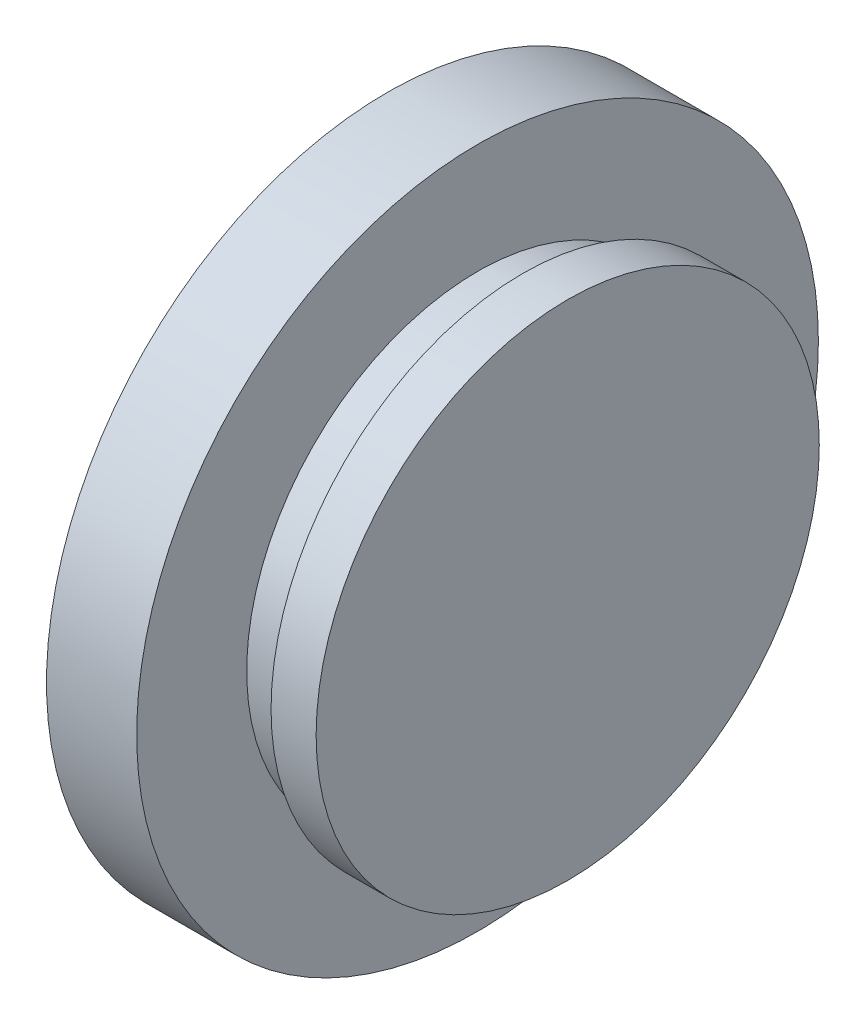
ISO-10303-21;
HEADER;
FILE_DESCRIPTION(('STEP AP214'),'2;1');
FILE_NAME('part.step','',(''),(''),'','','');
FILE_SCHEMA(('AUTOMOTIVE_DESIGN { 1 0 10303 214 1 1 1 1 }'));
ENDSEC;
DATA;
#1=APPLICATION_CONTEXT('core data for automotive mechanical design processes');
#2=APPLICATION_PROTOCOL_DEFINITION('international standard','automotive_design',2000,#1);
#3=PRODUCT_CONTEXT('',#1,'mechanical');
#4=PRODUCT('Part','Part','',(#3));
#5=PRODUCT_RELATED_PRODUCT_CATEGORY('part','',(#4));
#6=PRODUCT_DEFINITION_FORMATION('','',#4);
#7=PRODUCT_DEFINITION_CONTEXT('part definition',#1,'design');
#8=PRODUCT_DEFINITION('design','',#6,#7);
#9=PRODUCT_DEFINITION_SHAPE('','',#8);
#10=(LENGTH_UNIT() NAMED_UNIT(*) SI_UNIT(.MILLI.,.METRE.));
#11=(NAMED_UNIT(*) PLANE_ANGLE_UNIT() SI_UNIT($,.RADIAN.));
#12=(NAMED_UNIT(*) SI_UNIT($,.STERADIAN.) SOLID_ANGLE_UNIT());
#13=UNCERTAINTY_MEASURE_WITH_UNIT(LENGTH_MEASURE(1.E-05),#10,'distance_accuracy_value','');
#14=(GEOMETRIC_REPRESENTATION_CONTEXT(3) GLOBAL_UNCERTAINTY_ASSIGNED_CONTEXT((#13)) GLOBAL_UNIT_ASSIGNED_CONTEXT((#10,
#11,#12)) REPRESENTATION_CONTEXT('',''));
#15=CARTESIAN_POINT('',(0.,0.,0.));
#16=DIRECTION('',(0.,0.,1.));
#17=DIRECTION('',(1.,0.,0.));
#18=AXIS2_PLACEMENT_3D('',#15,#16,#17);
#19=CARTESIAN_POINT('',(5.,0.,0.));
#20=DIRECTION('',(-1.,0.,0.));
#21=DIRECTION('',(0.,0.,1.));
#22=AXIS2_PLACEMENT_3D('',#19,#20,#21);
#23=CYLINDRICAL_SURFACE('',#22,18.9);
#24=CARTESIAN_POINT('',(5.,0.,0.));
#25=DIRECTION('',(1.,0.,0.));
#26=DIRECTION('',(0.,0.,-1.));
#27=AXIS2_PLACEMENT_3D('',#24,#25,#26);
#28=CIRCLE('',#27,18.9);
#29=CARTESIAN_POINT('',(5.,0.,-18.9));
#30=VERTEX_POINT('',#29);
#31=EDGE_CURVE('E45',#30,#30,#28,.T.);
#32=ORIENTED_EDGE('',*,*,#31,.F.);
#33=EDGE_LOOP('',(#32));
#34=FACE_BOUND('',#33,.T.);
#35=CARTESIAN_POINT('',(0.,0.,0.));
#36=DIRECTION('',(1.,0.,0.));
#37=DIRECTION('',(0.,0.,-1.));
#38=AXIS2_PLACEMENT_3D('',#35,#36,#37);
#39=CIRCLE('',#38,18.9);
#40=CARTESIAN_POINT('',(0.,0.,-18.9));
#41=VERTEX_POINT('',#40);
#42=EDGE_CURVE('E40',#41,#41,#39,.T.);
#43=ORIENTED_EDGE('',*,*,#42,.T.);
#44=EDGE_LOOP('',(#43));
#45=FACE_BOUND('',#44,.T.);
#46=ADVANCED_FACE('F37',(#34,#45),#23,.T.);
#47=CARTESIAN_POINT('',(5.,0.,0.));
#48=DIRECTION('',(1.,0.,0.));
#49=DIRECTION('',(0.,0.,-1.));
#50=AXIS2_PLACEMENT_3D('',#47,#48,#49);
#51=PLANE('',#50);
#52=CARTESIAN_POINT('',(5.,0.,0.));
#53=DIRECTION('',(1.,0.,0.));
#54=DIRECTION('',(0.,0.,-1.));
#55=AXIS2_PLACEMENT_3D('',#52,#53,#54);
#56=CIRCLE('',#55,12.8);
#57=CARTESIAN_POINT('',(5.,0.,-12.8));
#58=VERTEX_POINT('',#57);
#59=EDGE_CURVE('E10',#58,#58,#56,.T.);
#60=ORIENTED_EDGE('',*,*,#59,.F.);
#61=EDGE_LOOP('',(#60));
#62=FACE_BOUND('',#61,.T.);
#63=ORIENTED_EDGE('',*,*,#31,.T.);
#64=EDGE_LOOP('',(#63));
#65=FACE_BOUND('',#64,.T.);
#66=ADVANCED_FACE('F91',(#62,#65),#51,.T.);
#67=CARTESIAN_POINT('',(0.,0.,0.));
#68=DIRECTION('',(1.,0.,0.));
#69=DIRECTION('',(0.,0.,-1.));
#70=AXIS2_PLACEMENT_3D('',#67,#68,#69);
#71=PLANE('',#70);
#72=CARTESIAN_POINT('',(0.,0.,0.));
#73=DIRECTION('',(1.,0.,0.));
#74=DIRECTION('',(0.,0.,-1.));
#75=AXIS2_PLACEMENT_3D('',#72,#73,#74);
#76=CIRCLE('',#75,17.9);
#77=CARTESIAN_POINT('',(0.,0.,-17.9));
#78=VERTEX_POINT('',#77);
#79=EDGE_CURVE('E59',#78,#78,#76,.T.);
#80=ORIENTED_EDGE('',*,*,#79,.T.);
#81=EDGE_LOOP('',(#80));
#82=FACE_BOUND('',#81,.T.);
#83=ORIENTED_EDGE('',*,*,#42,.F.);
#84=EDGE_LOOP('',(#83));
#85=FACE_BOUND('',#84,.T.);
#86=ADVANCED_FACE('F96',(#82,#85),#71,.F.);
#87=CARTESIAN_POINT('',(3.95,0.,0.));
#88=DIRECTION('',(-1.,0.,0.));
#89=DIRECTION('',(0.,0.,1.));
#90=AXIS2_PLACEMENT_3D('',#87,#88,#89);
#91=CYLINDRICAL_SURFACE('',#90,17.9);
#92=CARTESIAN_POINT('',(3.95,0.,0.));
#93=DIRECTION('',(1.,0.,0.));
#94=DIRECTION('',(0.,0.,-1.));
#95=AXIS2_PLACEMENT_3D('',#92,#93,#94);
#96=CIRCLE('',#95,17.9);
#97=CARTESIAN_POINT('',(3.95,0.,-17.9));
#98=VERTEX_POINT('',#97);
#99=EDGE_CURVE('E55',#98,#98,#96,.T.);
#100=ORIENTED_EDGE('',*,*,#99,.T.);
#101=EDGE_LOOP('',(#100));
#102=FACE_BOUND('',#101,.T.);
#103=ORIENTED_EDGE('',*,*,#79,.F.);
#104=EDGE_LOOP('',(#103));
#105=FACE_BOUND('',#104,.T.);
#106=ADVANCED_FACE('F106',(#102,#105),#91,.F.);
#107=CARTESIAN_POINT('',(3.95,0.,0.));
#108=DIRECTION('',(1.,0.,0.));
#109=DIRECTION('',(0.,0.,-1.));
#110=AXIS2_PLACEMENT_3D('',#107,#108,#109);
#111=PLANE('',#110);
#112=ORIENTED_EDGE('',*,*,#99,.F.);
#113=EDGE_LOOP('',(#112));
#114=FACE_BOUND('',#113,.T.);
#115=ADVANCED_FACE('F110',(#114),#111,.F.);
#116=CARTESIAN_POINT('',(7.5,0.,0.));
#117=DIRECTION('',(-1.,0.,0.));
#118=DIRECTION('',(0.,0.,1.));
#119=AXIS2_PLACEMENT_3D('',#116,#117,#118);
#120=CYLINDRICAL_SURFACE('',#119,12.8);
#121=CARTESIAN_POINT('',(7.5,0.,0.));
#122=DIRECTION('',(1.,0.,0.));
#123=DIRECTION('',(0.,0.,-1.));
#124=AXIS2_PLACEMENT_3D('',#121,#122,#123);
#125=CIRCLE('',#124,12.8);
#126=CARTESIAN_POINT('',(7.5,0.,-12.8));
#127=VERTEX_POINT('',#126);
#128=EDGE_CURVE('E53',#127,#127,#125,.T.);
#129=ORIENTED_EDGE('',*,*,#128,.F.);
#130=EDGE_LOOP('',(#129));
#131=FACE_BOUND('',#130,.T.);
#132=ORIENTED_EDGE('',*,*,#59,.T.);
#133=EDGE_LOOP('',(#132));
#134=FACE_BOUND('',#133,.T.);
#135=ADVANCED_FACE('F116',(#131,#134),#120,.T.);
#136=CARTESIAN_POINT('',(10.,0.,0.));
#137=DIRECTION('',(-1.,0.,0.));
#138=DIRECTION('',(0.,0.,1.));
#139=AXIS2_PLACEMENT_3D('',#136,#137,#138);
#140=CYLINDRICAL_SURFACE('',#139,13.95);
#141=CARTESIAN_POINT('',(10.,0.,0.));
#142=DIRECTION('',(1.,0.,0.));
#143=DIRECTION('',(0.,0.,-1.));
#144=AXIS2_PLACEMENT_3D('',#141,#142,#143);
#145=CIRCLE('',#144,13.95);
#146=CARTESIAN_POINT('',(10.,0.,-13.95));
#147=VERTEX_POINT('',#146);
#148=EDGE_CURVE('E66',#147,#147,#145,.T.);
#149=ORIENTED_EDGE('',*,*,#148,.F.);
#150=EDGE_LOOP('',(#149));
#151=FACE_BOUND('',#150,.T.);
#152=CARTESIAN_POINT('',(7.5,0.,0.));
#153=DIRECTION('',(1.,0.,0.));
#154=DIRECTION('',(0.,0.,-1.));
#155=AXIS2_PLACEMENT_3D('',#152,#153,#154);
#156=CIRCLE('',#155,13.95);
#157=CARTESIAN_POINT('',(7.5,0.,-13.95));
#158=VERTEX_POINT('',#157);
#159=EDGE_CURVE('E71',#158,#158,#156,.T.);
#160=ORIENTED_EDGE('',*,*,#159,.T.);
#161=EDGE_LOOP('',(#160));
#162=FACE_BOUND('',#161,.T.);
#163=ADVANCED_FACE('F79',(#151,#162),#140,.T.);
#164=CARTESIAN_POINT('',(10.,0.,0.));
#165=DIRECTION('',(1.,0.,0.));
#166=DIRECTION('',(0.,0.,-1.));
#167=AXIS2_PLACEMENT_3D('',#164,#165,#166);
#168=PLANE('',#167);
#169=ORIENTED_EDGE('',*,*,#148,.T.);
#170=EDGE_LOOP('',(#169));
#171=FACE_BOUND('',#170,.T.);
#172=ADVANCED_FACE('F83',(#171),#168,.T.);
#173=CARTESIAN_POINT('',(7.5,0.,0.));
#174=DIRECTION('',(1.,0.,0.));
#175=DIRECTION('',(0.,0.,-1.));
#176=AXIS2_PLACEMENT_3D('',#173,#174,#175);
#177=PLANE('',#176);
#178=ORIENTED_EDGE('',*,*,#128,.T.);
#179=EDGE_LOOP('',(#178));
#180=FACE_BOUND('',#179,.T.);
#181=ORIENTED_EDGE('',*,*,#159,.F.);
#182=EDGE_LOOP('',(#181));
#183=FACE_BOUND('',#182,.T.);
#184=ADVANCED_FACE('F81',(#180,#183),#177,.F.);
#185=CLOSED_SHELL('',(#46,#66,#86,#106,#115,#135,#163,#172,#184));
#186=MANIFOLD_SOLID_BREP('B2',#185);
#187=ADVANCED_BREP_SHAPE_REPRESENTATION('',(#18,#186),#14);
#188=SHAPE_DEFINITION_REPRESENTATION(#9,#187);
ENDSEC;
END-ISO-10303-21;
